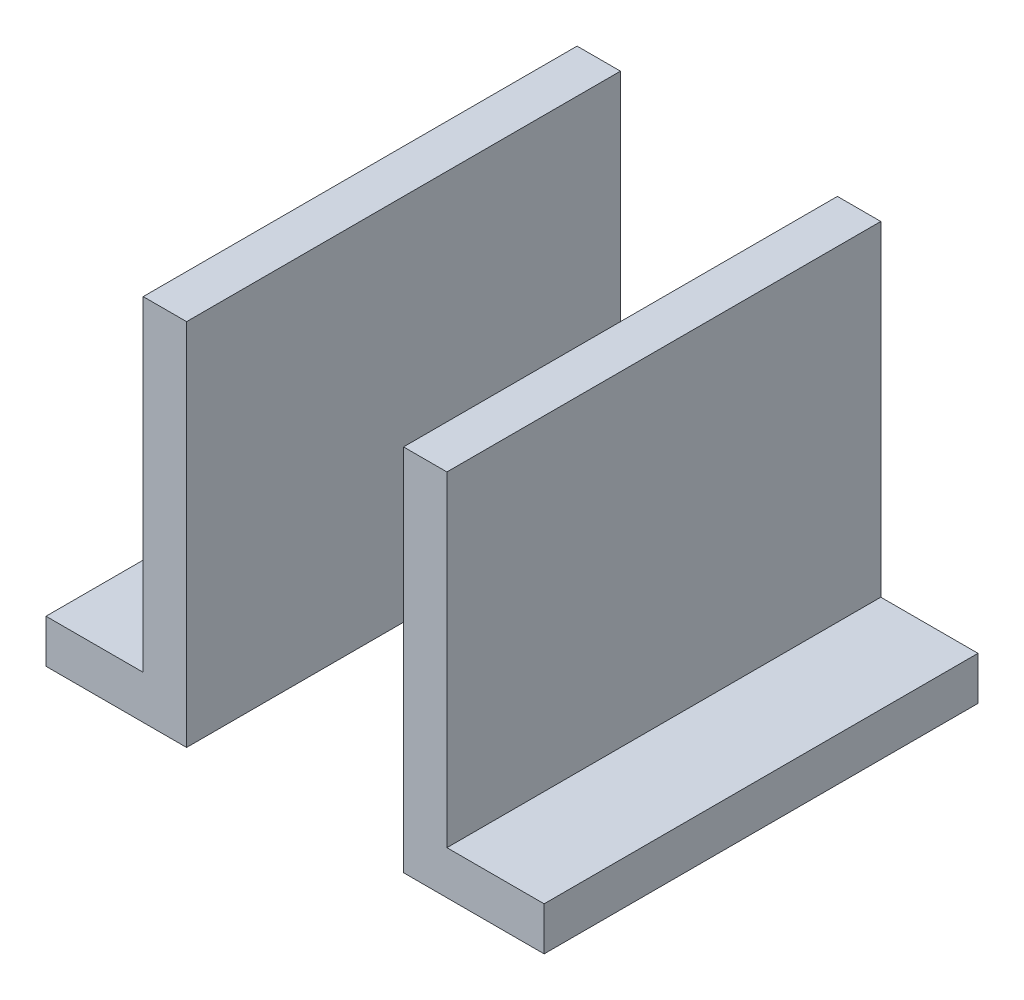
ISO-10303-21;
HEADER;
FILE_DESCRIPTION(('STEP AP214'),'2;1');
FILE_NAME('part.step','',(''),(''),'','','');
FILE_SCHEMA(('AUTOMOTIVE_DESIGN { 1 0 10303 214 1 1 1 1 }'));
ENDSEC;
DATA;
#1=APPLICATION_CONTEXT('core data for automotive mechanical design processes');
#2=APPLICATION_PROTOCOL_DEFINITION('international standard','automotive_design',2000,#1);
#3=PRODUCT_CONTEXT('',#1,'mechanical');
#4=PRODUCT('Part','Part','',(#3));
#5=PRODUCT_RELATED_PRODUCT_CATEGORY('part','',(#4));
#6=PRODUCT_DEFINITION_FORMATION('','',#4);
#7=PRODUCT_DEFINITION_CONTEXT('part definition',#1,'design');
#8=PRODUCT_DEFINITION('design','',#6,#7);
#9=PRODUCT_DEFINITION_SHAPE('','',#8);
#10=(LENGTH_UNIT() NAMED_UNIT(*) SI_UNIT(.MILLI.,.METRE.));
#11=(NAMED_UNIT(*) PLANE_ANGLE_UNIT() SI_UNIT($,.RADIAN.));
#12=(NAMED_UNIT(*) SI_UNIT($,.STERADIAN.) SOLID_ANGLE_UNIT());
#13=UNCERTAINTY_MEASURE_WITH_UNIT(LENGTH_MEASURE(1.E-05),#10,'distance_accuracy_value','');
#14=(GEOMETRIC_REPRESENTATION_CONTEXT(3) GLOBAL_UNCERTAINTY_ASSIGNED_CONTEXT((#13)) GLOBAL_UNIT_ASSIGNED_CONTEXT((#10,
#11,#12)) REPRESENTATION_CONTEXT('',''));
#15=CARTESIAN_POINT('',(0.,0.,0.));
#16=DIRECTION('',(0.,0.,1.));
#17=DIRECTION('',(1.,0.,0.));
#18=AXIS2_PLACEMENT_3D('',#15,#16,#17);
#19=CARTESIAN_POINT('',(-57.4040103991189,-35.4855461768779,100.));
#20=DIRECTION('',(1.,0.,0.));
#21=DIRECTION('',(0.,1.,0.));
#22=AXIS2_PLACEMENT_3D('',#19,#20,#21);
#23=PLANE('',#22);
#24=DIRECTION('',(0.,-1.,0.));
#25=VECTOR('',#24,1.);
#26=CARTESIAN_POINT('',(-57.4040103991189,-35.4855461768779,0.));
#27=LINE('',#26,#25);
#28=CARTESIAN_POINT('',(-57.4040103991189,-35.4855461768779,0.));
#29=VERTEX_POINT('',#28);
#30=CARTESIAN_POINT('',(-57.4040103991189,-45.4855461768779,0.));
#31=VERTEX_POINT('',#30);
#32=EDGE_CURVE('E127',#29,#31,#27,.T.);
#33=ORIENTED_EDGE('',*,*,#32,.T.);
#34=DIRECTION('',(0.,0.,-1.));
#35=VECTOR('',#34,1.);
#36=CARTESIAN_POINT('',(-57.4040103991189,-45.4855461768779,100.));
#37=LINE('',#36,#35);
#38=CARTESIAN_POINT('',(-57.4040103991189,-45.4855461768779,100.));
#39=VERTEX_POINT('',#38);
#40=EDGE_CURVE('E12',#39,#31,#37,.T.);
#41=ORIENTED_EDGE('',*,*,#40,.F.);
#42=DIRECTION('',(0.,-1.,0.));
#43=VECTOR('',#42,1.);
#44=CARTESIAN_POINT('',(-57.4040103991189,-35.4855461768779,100.));
#45=LINE('',#44,#43);
#46=CARTESIAN_POINT('',(-57.4040103991189,-35.4855461768779,100.));
#47=VERTEX_POINT('',#46);
#48=EDGE_CURVE('E137',#47,#39,#45,.T.);
#49=ORIENTED_EDGE('',*,*,#48,.F.);
#50=DIRECTION('',(0.,0.,-1.));
#51=VECTOR('',#50,1.);
#52=CARTESIAN_POINT('',(-57.4040103991189,-35.4855461768779,100.));
#53=LINE('',#52,#51);
#54=EDGE_CURVE('E123',#47,#29,#53,.T.);
#55=ORIENTED_EDGE('',*,*,#54,.T.);
#56=EDGE_LOOP('',(#33,#41,#49,#55));
#57=FACE_BOUND('',#56,.T.);
#58=ADVANCED_FACE('F43',(#57),#23,.F.);
#59=CARTESIAN_POINT('',(-57.4040103991189,-45.4855461768779,100.));
#60=DIRECTION('',(0.,1.,0.));
#61=DIRECTION('',(0.,0.,1.));
#62=AXIS2_PLACEMENT_3D('',#59,#60,#61);
#63=PLANE('',#62);
#64=DIRECTION('',(1.,0.,0.));
#65=VECTOR('',#64,1.);
#66=CARTESIAN_POINT('',(-57.4040103991189,-45.4855461768779,0.));
#67=LINE('',#66,#65);
#68=CARTESIAN_POINT('',(-25.,-45.4855461768779,0.));
#69=VERTEX_POINT('',#68);
#70=EDGE_CURVE('E130',#31,#69,#67,.T.);
#71=ORIENTED_EDGE('',*,*,#70,.T.);
#72=DIRECTION('',(0.,0.,-1.));
#73=VECTOR('',#72,1.);
#74=CARTESIAN_POINT('',(-25.,-45.4855461768779,100.));
#75=LINE('',#74,#73);
#76=CARTESIAN_POINT('',(-25.,-45.4855461768779,100.));
#77=VERTEX_POINT('',#76);
#78=EDGE_CURVE('E51',#77,#69,#75,.T.);
#79=ORIENTED_EDGE('',*,*,#78,.F.);
#80=DIRECTION('',(1.,0.,0.));
#81=VECTOR('',#80,1.);
#82=CARTESIAN_POINT('',(-57.4040103991189,-45.4855461768779,100.));
#83=LINE('',#82,#81);
#84=EDGE_CURVE('E96',#39,#77,#83,.T.);
#85=ORIENTED_EDGE('',*,*,#84,.F.);
#86=ORIENTED_EDGE('',*,*,#40,.T.);
#87=EDGE_LOOP('',(#71,#79,#85,#86));
#88=FACE_BOUND('',#87,.T.);
#89=ADVANCED_FACE('F161',(#88),#63,.F.);
#90=CARTESIAN_POINT('',(-25.,39.5144538231221,100.));
#91=DIRECTION('',(-1.,0.,0.));
#92=DIRECTION('',(0.,-1.,0.));
#93=AXIS2_PLACEMENT_3D('',#90,#91,#92);
#94=PLANE('',#93);
#95=DIRECTION('',(0.,1.,0.));
#96=VECTOR('',#95,1.);
#97=CARTESIAN_POINT('',(-25.,39.5144538231221,0.));
#98=LINE('',#97,#96);
#99=CARTESIAN_POINT('',(-25.,39.5144538231221,0.));
#100=VERTEX_POINT('',#99);
#101=EDGE_CURVE('E132',#69,#100,#98,.T.);
#102=ORIENTED_EDGE('',*,*,#101,.T.);
#103=DIRECTION('',(0.,0.,-1.));
#104=VECTOR('',#103,1.);
#105=CARTESIAN_POINT('',(-25.,39.5144538231221,100.));
#106=LINE('',#105,#104);
#107=CARTESIAN_POINT('',(-25.,39.5144538231221,100.));
#108=VERTEX_POINT('',#107);
#109=EDGE_CURVE('E118',#108,#100,#106,.T.);
#110=ORIENTED_EDGE('',*,*,#109,.F.);
#111=DIRECTION('',(0.,1.,0.));
#112=VECTOR('',#111,1.);
#113=CARTESIAN_POINT('',(-25.,39.5144538231221,100.));
#114=LINE('',#113,#112);
#115=EDGE_CURVE('E109',#77,#108,#114,.T.);
#116=ORIENTED_EDGE('',*,*,#115,.F.);
#117=ORIENTED_EDGE('',*,*,#78,.T.);
#118=EDGE_LOOP('',(#102,#110,#116,#117));
#119=FACE_BOUND('',#118,.T.);
#120=ADVANCED_FACE('F143',(#119),#94,.F.);
#121=CARTESIAN_POINT('',(-25.,39.5144538231221,100.));
#122=DIRECTION('',(0.,-1.,0.));
#123=DIRECTION('',(1.,0.,0.));
#124=AXIS2_PLACEMENT_3D('',#121,#122,#123);
#125=PLANE('',#124);
#126=DIRECTION('',(-1.,0.,0.));
#127=VECTOR('',#126,1.);
#128=CARTESIAN_POINT('',(-25.,39.5144538231221,0.));
#129=LINE('',#128,#127);
#130=CARTESIAN_POINT('',(-35.,39.5144538231221,0.));
#131=VERTEX_POINT('',#130);
#132=EDGE_CURVE('E117',#100,#131,#129,.T.);
#133=ORIENTED_EDGE('',*,*,#132,.T.);
#134=DIRECTION('',(0.,0.,-1.));
#135=VECTOR('',#134,1.);
#136=CARTESIAN_POINT('',(-35.,39.5144538231221,100.));
#137=LINE('',#136,#135);
#138=CARTESIAN_POINT('',(-35.,39.5144538231221,100.));
#139=VERTEX_POINT('',#138);
#140=EDGE_CURVE('E114',#139,#131,#137,.T.);
#141=ORIENTED_EDGE('',*,*,#140,.F.);
#142=DIRECTION('',(-1.,0.,0.));
#143=VECTOR('',#142,1.);
#144=CARTESIAN_POINT('',(-25.,39.5144538231221,100.));
#145=LINE('',#144,#143);
#146=EDGE_CURVE('E103',#108,#139,#145,.T.);
#147=ORIENTED_EDGE('',*,*,#146,.F.);
#148=ORIENTED_EDGE('',*,*,#109,.T.);
#149=EDGE_LOOP('',(#133,#141,#147,#148));
#150=FACE_BOUND('',#149,.T.);
#151=ADVANCED_FACE('F115',(#150),#125,.F.);
#152=CARTESIAN_POINT('',(-35.,39.5144538231221,100.));
#153=DIRECTION('',(1.,0.,0.));
#154=DIRECTION('',(0.,1.,0.));
#155=AXIS2_PLACEMENT_3D('',#152,#153,#154);
#156=PLANE('',#155);
#157=DIRECTION('',(0.,-1.,0.));
#158=VECTOR('',#157,1.);
#159=CARTESIAN_POINT('',(-35.,39.5144538231221,0.));
#160=LINE('',#159,#158);
#161=CARTESIAN_POINT('',(-35.,-35.4855461768779,0.));
#162=VERTEX_POINT('',#161);
#163=EDGE_CURVE('E82',#131,#162,#160,.T.);
#164=ORIENTED_EDGE('',*,*,#163,.T.);
#165=DIRECTION('',(0.,0.,-1.));
#166=VECTOR('',#165,1.);
#167=CARTESIAN_POINT('',(-35.,-35.4855461768779,100.));
#168=LINE('',#167,#166);
#169=CARTESIAN_POINT('',(-35.,-35.4855461768779,100.));
#170=VERTEX_POINT('',#169);
#171=EDGE_CURVE('E119',#170,#162,#168,.T.);
#172=ORIENTED_EDGE('',*,*,#171,.F.);
#173=DIRECTION('',(0.,-1.,0.));
#174=VECTOR('',#173,1.);
#175=CARTESIAN_POINT('',(-35.,39.5144538231221,100.));
#176=LINE('',#175,#174);
#177=EDGE_CURVE('E107',#139,#170,#176,.T.);
#178=ORIENTED_EDGE('',*,*,#177,.F.);
#179=ORIENTED_EDGE('',*,*,#140,.T.);
#180=EDGE_LOOP('',(#164,#172,#178,#179));
#181=FACE_BOUND('',#180,.T.);
#182=ADVANCED_FACE('F121',(#181),#156,.F.);
#183=CARTESIAN_POINT('',(-35.,-35.4855461768779,100.));
#184=DIRECTION('',(0.,-1.,0.));
#185=DIRECTION('',(0.,0.,-1.));
#186=AXIS2_PLACEMENT_3D('',#183,#184,#185);
#187=PLANE('',#186);
#188=DIRECTION('',(-1.,0.,0.));
#189=VECTOR('',#188,1.);
#190=CARTESIAN_POINT('',(-35.,-35.4855461768779,0.));
#191=LINE('',#190,#189);
#192=EDGE_CURVE('E88',#162,#29,#191,.T.);
#193=ORIENTED_EDGE('',*,*,#192,.T.);
#194=ORIENTED_EDGE('',*,*,#54,.F.);
#195=DIRECTION('',(-1.,0.,0.));
#196=VECTOR('',#195,1.);
#197=CARTESIAN_POINT('',(-35.,-35.4855461768779,100.));
#198=LINE('',#197,#196);
#199=EDGE_CURVE('E59',#170,#47,#198,.T.);
#200=ORIENTED_EDGE('',*,*,#199,.F.);
#201=ORIENTED_EDGE('',*,*,#171,.T.);
#202=EDGE_LOOP('',(#193,#194,#200,#201));
#203=FACE_BOUND('',#202,.T.);
#204=ADVANCED_FACE('F150',(#203),#187,.F.);
#205=CARTESIAN_POINT('',(0.,0.,100.));
#206=DIRECTION('',(0.,0.,1.));
#207=DIRECTION('',(1.,0.,0.));
#208=AXIS2_PLACEMENT_3D('',#205,#206,#207);
#209=PLANE('',#208);
#210=ORIENTED_EDGE('',*,*,#48,.T.);
#211=ORIENTED_EDGE('',*,*,#84,.T.);
#212=ORIENTED_EDGE('',*,*,#115,.T.);
#213=ORIENTED_EDGE('',*,*,#146,.T.);
#214=ORIENTED_EDGE('',*,*,#177,.T.);
#215=ORIENTED_EDGE('',*,*,#199,.T.);
#216=EDGE_LOOP('',(#210,#211,#212,#213,#214,#215));
#217=FACE_BOUND('',#216,.T.);
#218=ADVANCED_FACE('F105',(#217),#209,.T.);
#219=CARTESIAN_POINT('',(0.,0.,0.));
#220=DIRECTION('',(0.,0.,1.));
#221=DIRECTION('',(1.,0.,0.));
#222=AXIS2_PLACEMENT_3D('',#219,#220,#221);
#223=PLANE('',#222);
#224=ORIENTED_EDGE('',*,*,#32,.F.);
#225=ORIENTED_EDGE('',*,*,#192,.F.);
#226=ORIENTED_EDGE('',*,*,#163,.F.);
#227=ORIENTED_EDGE('',*,*,#132,.F.);
#228=ORIENTED_EDGE('',*,*,#101,.F.);
#229=ORIENTED_EDGE('',*,*,#70,.F.);
#230=EDGE_LOOP('',(#224,#225,#226,#227,#228,#229));
#231=FACE_BOUND('',#230,.T.);
#232=ADVANCED_FACE('F146',(#231),#223,.F.);
#233=CLOSED_SHELL('',(#58,#89,#120,#151,#182,#204,#218,#232));
#234=MANIFOLD_SOLID_BREP('B2',#233);
#235=CARTESIAN_POINT('',(25.,39.5144538231221,100.));
#236=DIRECTION('',(1.,0.,0.));
#237=DIRECTION('',(0.,1.,0.));
#238=AXIS2_PLACEMENT_3D('',#235,#236,#237);
#239=PLANE('',#238);
#240=DIRECTION('',(0.,-1.,0.));
#241=VECTOR('',#240,1.);
#242=CARTESIAN_POINT('',(25.,39.5144538231221,0.));
#243=LINE('',#242,#241);
#244=CARTESIAN_POINT('',(25.,39.5144538231221,0.));
#245=VERTEX_POINT('',#244);
#246=CARTESIAN_POINT('',(25.,-45.4855461768779,0.));
#247=VERTEX_POINT('',#246);
#248=EDGE_CURVE('E303',#245,#247,#243,.T.);
#249=ORIENTED_EDGE('',*,*,#248,.T.);
#250=DIRECTION('',(0.,0.,-1.));
#251=VECTOR('',#250,1.);
#252=CARTESIAN_POINT('',(25.,-45.4855461768779,100.));
#253=LINE('',#252,#251);
#254=CARTESIAN_POINT('',(25.,-45.4855461768779,100.));
#255=VERTEX_POINT('',#254);
#256=EDGE_CURVE('E41',#255,#247,#253,.T.);
#257=ORIENTED_EDGE('',*,*,#256,.F.);
#258=DIRECTION('',(0.,-1.,0.));
#259=VECTOR('',#258,1.);
#260=CARTESIAN_POINT('',(25.,39.5144538231221,100.));
#261=LINE('',#260,#259);
#262=CARTESIAN_POINT('',(25.,39.5144538231221,100.));
#263=VERTEX_POINT('',#262);
#264=EDGE_CURVE('E313',#263,#255,#261,.T.);
#265=ORIENTED_EDGE('',*,*,#264,.F.);
#266=DIRECTION('',(0.,0.,-1.));
#267=VECTOR('',#266,1.);
#268=CARTESIAN_POINT('',(25.,39.5144538231221,100.));
#269=LINE('',#268,#267);
#270=EDGE_CURVE('E299',#263,#245,#269,.T.);
#271=ORIENTED_EDGE('',*,*,#270,.T.);
#272=EDGE_LOOP('',(#249,#257,#265,#271));
#273=FACE_BOUND('',#272,.T.);
#274=ADVANCED_FACE('F219',(#273),#239,.F.);
#275=CARTESIAN_POINT('',(57.4040103991189,-45.4855461768779,100.));
#276=DIRECTION('',(0.,1.,0.));
#277=DIRECTION('',(0.,0.,1.));
#278=AXIS2_PLACEMENT_3D('',#275,#276,#277);
#279=PLANE('',#278);
#280=DIRECTION('',(1.,0.,0.));
#281=VECTOR('',#280,1.);
#282=CARTESIAN_POINT('',(57.4040103991189,-45.4855461768779,0.));
#283=LINE('',#282,#281);
#284=CARTESIAN_POINT('',(57.4040103991189,-45.4855461768779,0.));
#285=VERTEX_POINT('',#284);
#286=EDGE_CURVE('E306',#247,#285,#283,.T.);
#287=ORIENTED_EDGE('',*,*,#286,.T.);
#288=DIRECTION('',(0.,0.,-1.));
#289=VECTOR('',#288,1.);
#290=CARTESIAN_POINT('',(57.4040103991189,-45.4855461768779,100.));
#291=LINE('',#290,#289);
#292=CARTESIAN_POINT('',(57.4040103991189,-45.4855461768779,100.));
#293=VERTEX_POINT('',#292);
#294=EDGE_CURVE('E227',#293,#285,#291,.T.);
#295=ORIENTED_EDGE('',*,*,#294,.F.);
#296=DIRECTION('',(1.,0.,0.));
#297=VECTOR('',#296,1.);
#298=CARTESIAN_POINT('',(57.4040103991189,-45.4855461768779,100.));
#299=LINE('',#298,#297);
#300=EDGE_CURVE('E272',#255,#293,#299,.T.);
#301=ORIENTED_EDGE('',*,*,#300,.F.);
#302=ORIENTED_EDGE('',*,*,#256,.T.);
#303=EDGE_LOOP('',(#287,#295,#301,#302));
#304=FACE_BOUND('',#303,.T.);
#305=ADVANCED_FACE('F337',(#304),#279,.F.);
#306=CARTESIAN_POINT('',(57.4040103991189,-35.4855461768779,100.));
#307=DIRECTION('',(-1.,0.,0.));
#308=DIRECTION('',(0.,-1.,0.));
#309=AXIS2_PLACEMENT_3D('',#306,#307,#308);
#310=PLANE('',#309);
#311=DIRECTION('',(0.,1.,0.));
#312=VECTOR('',#311,1.);
#313=CARTESIAN_POINT('',(57.4040103991189,-35.4855461768779,0.));
#314=LINE('',#313,#312);
#315=CARTESIAN_POINT('',(57.4040103991189,-35.4855461768779,0.));
#316=VERTEX_POINT('',#315);
#317=EDGE_CURVE('E308',#285,#316,#314,.T.);
#318=ORIENTED_EDGE('',*,*,#317,.T.);
#319=DIRECTION('',(0.,0.,-1.));
#320=VECTOR('',#319,1.);
#321=CARTESIAN_POINT('',(57.4040103991189,-35.4855461768779,100.));
#322=LINE('',#321,#320);
#323=CARTESIAN_POINT('',(57.4040103991189,-35.4855461768779,100.));
#324=VERTEX_POINT('',#323);
#325=EDGE_CURVE('E294',#324,#316,#322,.T.);
#326=ORIENTED_EDGE('',*,*,#325,.F.);
#327=DIRECTION('',(0.,1.,0.));
#328=VECTOR('',#327,1.);
#329=CARTESIAN_POINT('',(57.4040103991189,-35.4855461768779,100.));
#330=LINE('',#329,#328);
#331=EDGE_CURVE('E285',#293,#324,#330,.T.);
#332=ORIENTED_EDGE('',*,*,#331,.F.);
#333=ORIENTED_EDGE('',*,*,#294,.T.);
#334=EDGE_LOOP('',(#318,#326,#332,#333));
#335=FACE_BOUND('',#334,.T.);
#336=ADVANCED_FACE('F319',(#335),#310,.F.);
#337=CARTESIAN_POINT('',(35.,-35.4855461768779,100.));
#338=DIRECTION('',(0.,-1.,0.));
#339=DIRECTION('',(0.,0.,-1.));
#340=AXIS2_PLACEMENT_3D('',#337,#338,#339);
#341=PLANE('',#340);
#342=DIRECTION('',(-1.,0.,0.));
#343=VECTOR('',#342,1.);
#344=CARTESIAN_POINT('',(35.,-35.4855461768779,0.));
#345=LINE('',#344,#343);
#346=CARTESIAN_POINT('',(35.,-35.4855461768779,0.));
#347=VERTEX_POINT('',#346);
#348=EDGE_CURVE('E293',#316,#347,#345,.T.);
#349=ORIENTED_EDGE('',*,*,#348,.T.);
#350=DIRECTION('',(0.,0.,-1.));
#351=VECTOR('',#350,1.);
#352=CARTESIAN_POINT('',(35.,-35.4855461768779,100.));
#353=LINE('',#352,#351);
#354=CARTESIAN_POINT('',(35.,-35.4855461768779,100.));
#355=VERTEX_POINT('',#354);
#356=EDGE_CURVE('E290',#355,#347,#353,.T.);
#357=ORIENTED_EDGE('',*,*,#356,.F.);
#358=DIRECTION('',(-1.,0.,0.));
#359=VECTOR('',#358,1.);
#360=CARTESIAN_POINT('',(35.,-35.4855461768779,100.));
#361=LINE('',#360,#359);
#362=EDGE_CURVE('E279',#324,#355,#361,.T.);
#363=ORIENTED_EDGE('',*,*,#362,.F.);
#364=ORIENTED_EDGE('',*,*,#325,.T.);
#365=EDGE_LOOP('',(#349,#357,#363,#364));
#366=FACE_BOUND('',#365,.T.);
#367=ADVANCED_FACE('F291',(#366),#341,.F.);
#368=CARTESIAN_POINT('',(35.,39.5144538231221,100.));
#369=DIRECTION('',(-1.,0.,0.));
#370=DIRECTION('',(0.,-1.,0.));
#371=AXIS2_PLACEMENT_3D('',#368,#369,#370);
#372=PLANE('',#371);
#373=DIRECTION('',(0.,1.,0.));
#374=VECTOR('',#373,1.);
#375=CARTESIAN_POINT('',(35.,39.5144538231221,0.));
#376=LINE('',#375,#374);
#377=CARTESIAN_POINT('',(35.,39.5144538231221,0.));
#378=VERTEX_POINT('',#377);
#379=EDGE_CURVE('E258',#347,#378,#376,.T.);
#380=ORIENTED_EDGE('',*,*,#379,.T.);
#381=DIRECTION('',(0.,0.,-1.));
#382=VECTOR('',#381,1.);
#383=CARTESIAN_POINT('',(35.,39.5144538231221,100.));
#384=LINE('',#383,#382);
#385=CARTESIAN_POINT('',(35.,39.5144538231221,100.));
#386=VERTEX_POINT('',#385);
#387=EDGE_CURVE('E295',#386,#378,#384,.T.);
#388=ORIENTED_EDGE('',*,*,#387,.F.);
#389=DIRECTION('',(0.,1.,0.));
#390=VECTOR('',#389,1.);
#391=CARTESIAN_POINT('',(35.,39.5144538231221,100.));
#392=LINE('',#391,#390);
#393=EDGE_CURVE('E283',#355,#386,#392,.T.);
#394=ORIENTED_EDGE('',*,*,#393,.F.);
#395=ORIENTED_EDGE('',*,*,#356,.T.);
#396=EDGE_LOOP('',(#380,#388,#394,#395));
#397=FACE_BOUND('',#396,.T.);
#398=ADVANCED_FACE('F297',(#397),#372,.F.);
#399=CARTESIAN_POINT('',(25.,39.5144538231221,100.));
#400=DIRECTION('',(0.,-1.,0.));
#401=DIRECTION('',(1.,0.,0.));
#402=AXIS2_PLACEMENT_3D('',#399,#400,#401);
#403=PLANE('',#402);
#404=DIRECTION('',(-1.,0.,0.));
#405=VECTOR('',#404,1.);
#406=CARTESIAN_POINT('',(25.,39.5144538231221,0.));
#407=LINE('',#406,#405);
#408=EDGE_CURVE('E264',#378,#245,#407,.T.);
#409=ORIENTED_EDGE('',*,*,#408,.T.);
#410=ORIENTED_EDGE('',*,*,#270,.F.);
#411=DIRECTION('',(-1.,0.,0.));
#412=VECTOR('',#411,1.);
#413=CARTESIAN_POINT('',(25.,39.5144538231221,100.));
#414=LINE('',#413,#412);
#415=EDGE_CURVE('E235',#386,#263,#414,.T.);
#416=ORIENTED_EDGE('',*,*,#415,.F.);
#417=ORIENTED_EDGE('',*,*,#387,.T.);
#418=EDGE_LOOP('',(#409,#410,#416,#417));
#419=FACE_BOUND('',#418,.T.);
#420=ADVANCED_FACE('F326',(#419),#403,.F.);
#421=CARTESIAN_POINT('',(0.,0.,100.));
#422=DIRECTION('',(0.,0.,-1.));
#423=DIRECTION('',(-1.,0.,0.));
#424=AXIS2_PLACEMENT_3D('',#421,#422,#423);
#425=PLANE('',#424);
#426=ORIENTED_EDGE('',*,*,#264,.T.);
#427=ORIENTED_EDGE('',*,*,#300,.T.);
#428=ORIENTED_EDGE('',*,*,#331,.T.);
#429=ORIENTED_EDGE('',*,*,#362,.T.);
#430=ORIENTED_EDGE('',*,*,#393,.T.);
#431=ORIENTED_EDGE('',*,*,#415,.T.);
#432=EDGE_LOOP('',(#426,#427,#428,#429,#430,#431));
#433=FACE_BOUND('',#432,.T.);
#434=ADVANCED_FACE('F281',(#433),#425,.F.);
#435=CARTESIAN_POINT('',(0.,0.,0.));
#436=DIRECTION('',(0.,0.,-1.));
#437=DIRECTION('',(-1.,0.,0.));
#438=AXIS2_PLACEMENT_3D('',#435,#436,#437);
#439=PLANE('',#438);
#440=ORIENTED_EDGE('',*,*,#248,.F.);
#441=ORIENTED_EDGE('',*,*,#408,.F.);
#442=ORIENTED_EDGE('',*,*,#379,.F.);
#443=ORIENTED_EDGE('',*,*,#348,.F.);
#444=ORIENTED_EDGE('',*,*,#317,.F.);
#445=ORIENTED_EDGE('',*,*,#286,.F.);
#446=EDGE_LOOP('',(#440,#441,#442,#443,#444,#445));
#447=FACE_BOUND('',#446,.T.);
#448=ADVANCED_FACE('F322',(#447),#439,.T.);
#449=CLOSED_SHELL('',(#274,#305,#336,#367,#398,#420,#434,#448));
#450=MANIFOLD_SOLID_BREP('B6',#449);
#451=ADVANCED_BREP_SHAPE_REPRESENTATION('',(#18,#234,#450),#14);
#452=SHAPE_DEFINITION_REPRESENTATION(#9,#451);
ENDSEC;
END-ISO-10303-21;
